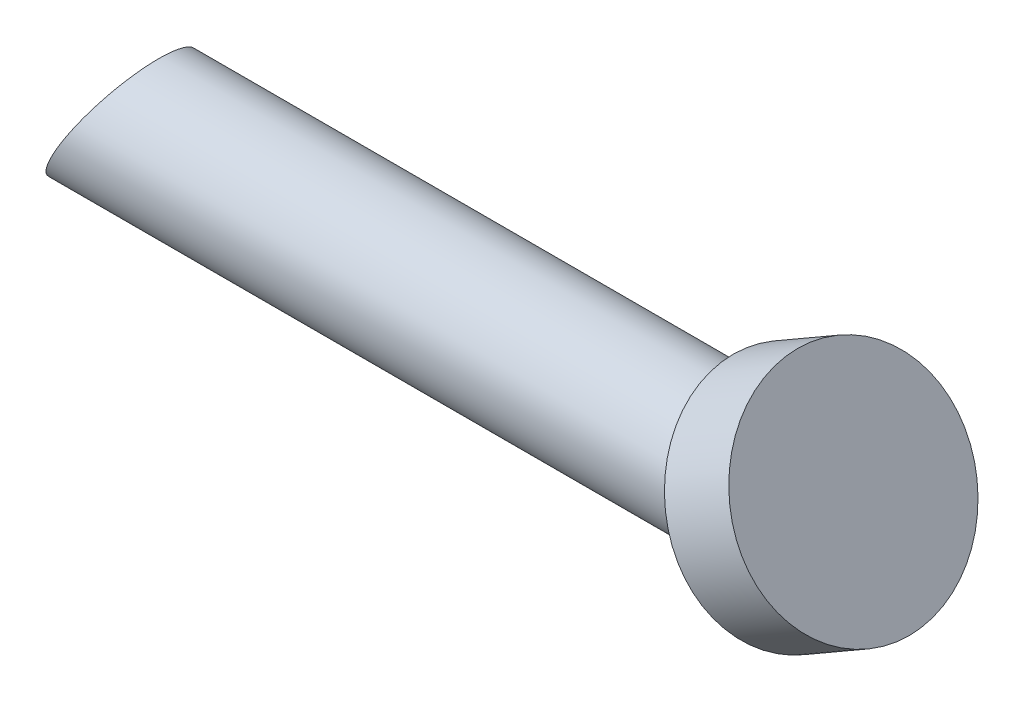
ISO-10303-21;
HEADER;
FILE_DESCRIPTION(('STEP AP214'),'2;1');
FILE_NAME('part.step','',(''),(''),'','','');
FILE_SCHEMA(('AUTOMOTIVE_DESIGN { 1 0 10303 214 1 1 1 1 }'));
ENDSEC;
DATA;
#1=APPLICATION_CONTEXT('core data for automotive mechanical design processes');
#2=APPLICATION_PROTOCOL_DEFINITION('international standard','automotive_design',2000,#1);
#3=PRODUCT_CONTEXT('',#1,'mechanical');
#4=PRODUCT('Part','Part','',(#3));
#5=PRODUCT_RELATED_PRODUCT_CATEGORY('part','',(#4));
#6=PRODUCT_DEFINITION_FORMATION('','',#4);
#7=PRODUCT_DEFINITION_CONTEXT('part definition',#1,'design');
#8=PRODUCT_DEFINITION('design','',#6,#7);
#9=PRODUCT_DEFINITION_SHAPE('','',#8);
#10=(LENGTH_UNIT() NAMED_UNIT(*) SI_UNIT(.MILLI.,.METRE.));
#11=(NAMED_UNIT(*) PLANE_ANGLE_UNIT() SI_UNIT($,.RADIAN.));
#12=(NAMED_UNIT(*) SI_UNIT($,.STERADIAN.) SOLID_ANGLE_UNIT());
#13=UNCERTAINTY_MEASURE_WITH_UNIT(LENGTH_MEASURE(1.E-05),#10,'distance_accuracy_value','');
#14=(GEOMETRIC_REPRESENTATION_CONTEXT(3) GLOBAL_UNCERTAINTY_ASSIGNED_CONTEXT((#13)) GLOBAL_UNIT_ASSIGNED_CONTEXT((#10,
#11,#12)) REPRESENTATION_CONTEXT('',''));
#15=CARTESIAN_POINT('',(0.,0.,0.));
#16=DIRECTION('',(0.,0.,1.));
#17=DIRECTION('',(1.,0.,0.));
#18=AXIS2_PLACEMENT_3D('',#15,#16,#17);
#19=CARTESIAN_POINT('',(5.,0.,0.));
#20=DIRECTION('',(-1.,0.,0.));
#21=DIRECTION('',(0.,0.,1.));
#22=AXIS2_PLACEMENT_3D('',#19,#20,#21);
#23=CYLINDRICAL_SURFACE('',#22,0.875);
#24=CARTESIAN_POINT('',(-4.49481851445908,0.,0.));
#25=DIRECTION('',(0.866025403784442,-0.499999999999995,0.));
#26=DIRECTION('',(-0.499999999999995,-0.866025403784442,0.));
#27=AXIS2_PLACEMENT_3D('',#24,#25,#26);
#28=ELLIPSE('',#27,1.01036297108184,0.875);
#29=CARTESIAN_POINT('',(-5.,-0.875,0.));
#30=VERTEX_POINT('',#29);
#31=EDGE_CURVE('E49',#30,#30,#28,.T.);
#32=ORIENTED_EDGE('',*,*,#31,.T.);
#33=EDGE_LOOP('',(#32));
#34=FACE_BOUND('',#33,.T.);
#35=CARTESIAN_POINT('',(4.49481851445908,0.,0.));
#36=DIRECTION('',(0.866025403784438,0.500000000000001,0.));
#37=DIRECTION('',(-0.500000000000001,0.866025403784438,0.));
#38=AXIS2_PLACEMENT_3D('',#35,#36,#37);
#39=ELLIPSE('',#38,1.01036297108185,0.875);
#40=CARTESIAN_POINT('',(3.98963702891815,0.875,0.));
#41=VERTEX_POINT('',#40);
#42=EDGE_CURVE('E11',#41,#41,#39,.T.);
#43=ORIENTED_EDGE('',*,*,#42,.F.);
#44=EDGE_LOOP('',(#43));
#45=FACE_BOUND('',#44,.T.);
#46=ADVANCED_FACE('F42',(#34,#45),#23,.T.);
#47=CARTESIAN_POINT('',(-3.37111388584434,1.94631350946109,-0.875));
#48=DIRECTION('',(0.866025403784442,-0.499999999999995,0.));
#49=DIRECTION('',(0.499999999999995,0.866025403784442,0.));
#50=AXIS2_PLACEMENT_3D('',#47,#48,#49);
#51=PLANE('',#50);
#52=ORIENTED_EDGE('',*,*,#31,.F.);
#53=EDGE_LOOP('',(#52));
#54=FACE_BOUND('',#53,.T.);
#55=ADVANCED_FACE('F79',(#54),#51,.F.);
#56=CARTESIAN_POINT('',(5.36084391824352,0.500000000000001,0.));
#57=DIRECTION('',(-0.866025403784438,-0.500000000000001,0.));
#58=DIRECTION('',(0.500000000000001,-0.866025403784438,0.));
#59=AXIS2_PLACEMENT_3D('',#56,#57,#58);
#60=CYLINDRICAL_SURFACE('',#59,1.5);
#61=CARTESIAN_POINT('',(5.36084391824352,0.500000000000001,0.));
#62=DIRECTION('',(0.866025403784438,0.500000000000001,0.));
#63=DIRECTION('',(-0.500000000000001,0.866025403784438,0.));
#64=AXIS2_PLACEMENT_3D('',#61,#62,#63);
#65=CIRCLE('',#64,1.5);
#66=CARTESIAN_POINT('',(4.61084391824351,1.79903810567666,0.));
#67=VERTEX_POINT('',#66);
#68=EDGE_CURVE('E54',#67,#67,#65,.T.);
#69=ORIENTED_EDGE('',*,*,#68,.F.);
#70=EDGE_LOOP('',(#69));
#71=FACE_BOUND('',#70,.T.);
#72=CARTESIAN_POINT('',(4.49481851445908,0.,0.));
#73=DIRECTION('',(0.866025403784438,0.500000000000001,0.));
#74=DIRECTION('',(-0.500000000000001,0.866025403784438,0.));
#75=AXIS2_PLACEMENT_3D('',#72,#73,#74);
#76=CIRCLE('',#75,1.5);
#77=CARTESIAN_POINT('',(3.74481851445908,1.29903810567666,0.));
#78=VERTEX_POINT('',#77);
#79=EDGE_CURVE('E59',#78,#78,#76,.T.);
#80=ORIENTED_EDGE('',*,*,#79,.T.);
#81=EDGE_LOOP('',(#80));
#82=FACE_BOUND('',#81,.T.);
#83=ADVANCED_FACE('F66',(#71,#82),#60,.T.);
#84=CARTESIAN_POINT('',(5.36084391824352,0.500000000000001,0.));
#85=DIRECTION('',(0.866025403784438,0.500000000000001,0.));
#86=DIRECTION('',(-0.500000000000001,0.866025403784438,0.));
#87=AXIS2_PLACEMENT_3D('',#84,#85,#86);
#88=PLANE('',#87);
#89=ORIENTED_EDGE('',*,*,#68,.T.);
#90=EDGE_LOOP('',(#89));
#91=FACE_BOUND('',#90,.T.);
#92=ADVANCED_FACE('F70',(#91),#88,.T.);
#93=CARTESIAN_POINT('',(4.49481851445908,0.,0.));
#94=DIRECTION('',(0.866025403784438,0.500000000000001,0.));
#95=DIRECTION('',(-0.500000000000001,0.866025403784438,0.));
#96=AXIS2_PLACEMENT_3D('',#93,#94,#95);
#97=PLANE('',#96);
#98=ORIENTED_EDGE('',*,*,#42,.T.);
#99=EDGE_LOOP('',(#98));
#100=FACE_BOUND('',#99,.T.);
#101=ORIENTED_EDGE('',*,*,#79,.F.);
#102=EDGE_LOOP('',(#101));
#103=FACE_BOUND('',#102,.T.);
#104=ADVANCED_FACE('F68',(#100,#103),#97,.F.);
#105=CLOSED_SHELL('',(#46,#55,#83,#92,#104));
#106=MANIFOLD_SOLID_BREP('B2',#105);
#107=ADVANCED_BREP_SHAPE_REPRESENTATION('',(#18,#106),#14);
#108=SHAPE_DEFINITION_REPRESENTATION(#9,#107);
ENDSEC;
END-ISO-10303-21;
